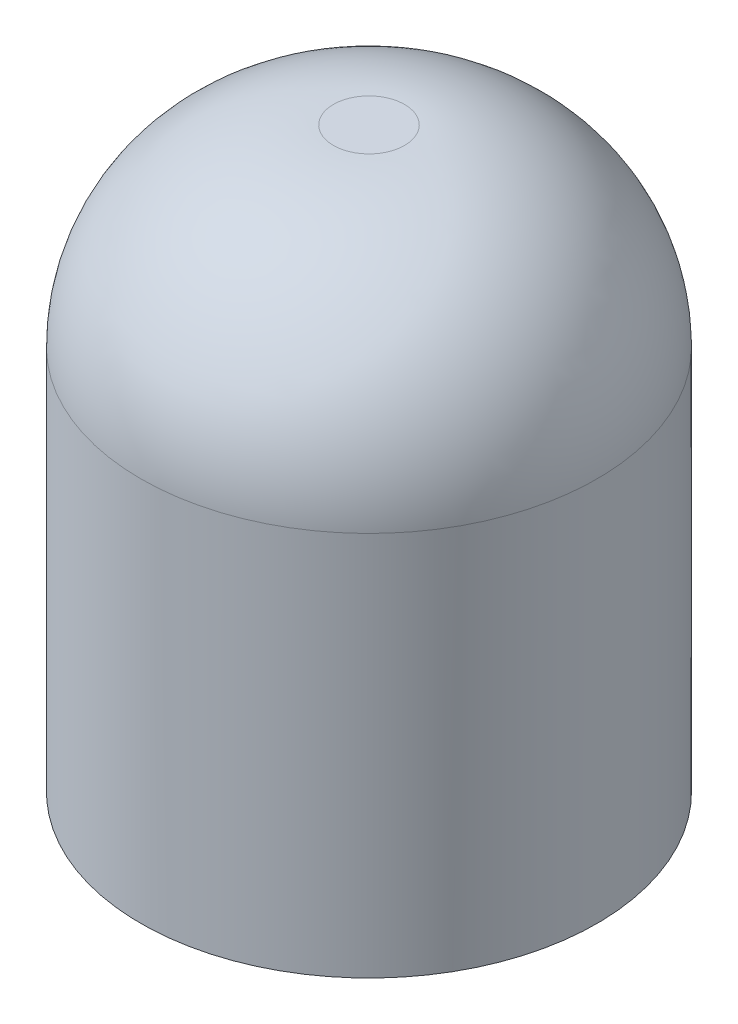
ISO-10303-21;
HEADER;
FILE_DESCRIPTION(('STEP AP214'),'2;1');
FILE_NAME('part.step','',(''),(''),'','','');
FILE_SCHEMA(('AUTOMOTIVE_DESIGN { 1 0 10303 214 1 1 1 1 }'));
ENDSEC;
DATA;
#1=APPLICATION_CONTEXT('core data for automotive mechanical design processes');
#2=APPLICATION_PROTOCOL_DEFINITION('international standard','automotive_design',2000,#1);
#3=PRODUCT_CONTEXT('',#1,'mechanical');
#4=PRODUCT('Part','Part','',(#3));
#5=PRODUCT_RELATED_PRODUCT_CATEGORY('part','',(#4));
#6=PRODUCT_DEFINITION_FORMATION('','',#4);
#7=PRODUCT_DEFINITION_CONTEXT('part definition',#1,'design');
#8=PRODUCT_DEFINITION('design','',#6,#7);
#9=PRODUCT_DEFINITION_SHAPE('','',#8);
#10=(LENGTH_UNIT() NAMED_UNIT(*) SI_UNIT(.MILLI.,.METRE.));
#11=(NAMED_UNIT(*) PLANE_ANGLE_UNIT() SI_UNIT($,.RADIAN.));
#12=(NAMED_UNIT(*) SI_UNIT($,.STERADIAN.) SOLID_ANGLE_UNIT());
#13=UNCERTAINTY_MEASURE_WITH_UNIT(LENGTH_MEASURE(1.E-05),#10,'distance_accuracy_value','');
#14=(GEOMETRIC_REPRESENTATION_CONTEXT(3) GLOBAL_UNCERTAINTY_ASSIGNED_CONTEXT((#13)) GLOBAL_UNIT_ASSIGNED_CONTEXT((#10,
#11,#12)) REPRESENTATION_CONTEXT('',''));
#15=CARTESIAN_POINT('',(0.,0.,0.));
#16=DIRECTION('',(0.,0.,1.));
#17=DIRECTION('',(1.,0.,0.));
#18=AXIS2_PLACEMENT_3D('',#15,#16,#17);
#19=CARTESIAN_POINT('',(0.,76.2,0.));
#20=DIRECTION('',(0.,-1.,0.));
#21=DIRECTION('',(0.,0.,-1.));
#22=AXIS2_PLACEMENT_3D('',#19,#20,#21);
#23=CYLINDRICAL_SURFACE('',#22,30.0913736250683);
#24=CARTESIAN_POINT('',(0.,50.8,0.));
#25=DIRECTION('',(0.,1.,0.));
#26=DIRECTION('',(0.,0.,1.));
#27=AXIS2_PLACEMENT_3D('',#24,#25,#26);
#28=CIRCLE('',#27,30.0913736250683);
#29=CARTESIAN_POINT('',(0.,50.8,-30.0913736250683));
#30=VERTEX_POINT('',#29);
#31=EDGE_CURVE('E10',#30,#30,#28,.F.);
#32=CARTESIAN_POINT('',(0.,0.,0.));
#33=DIRECTION('',(0.,1.,0.));
#34=DIRECTION('',(0.,0.,1.));
#35=AXIS2_PLACEMENT_3D('',#32,#33,#34);
#36=CIRCLE('',#35,30.0913736250683);
#37=CARTESIAN_POINT('',(0.,0.,-30.0913736250683));
#38=VERTEX_POINT('',#37);
#39=EDGE_CURVE('E42',#38,#38,#36,.T.);
#40=CARTESIAN_POINT('',(0.,50.8,-30.0913736250683));
#41=CARTESIAN_POINT('',(0.,50.2708333333333,-30.0913736250683));
#42=CARTESIAN_POINT('',(0.,49.7416666666666,-30.0913736250683));
#43=CARTESIAN_POINT('',(0.,48.6833333333333,-30.0913736250683));
#44=CARTESIAN_POINT('',(0.,48.1541666666666,-30.0913736250683));
#45=CARTESIAN_POINT('',(0.,47.0958333333333,-30.0913736250683));
#46=CARTESIAN_POINT('',(0.,46.5666666666666,-30.0913736250683));
#47=CARTESIAN_POINT('',(0.,45.5083333333333,-30.0913736250683));
#48=CARTESIAN_POINT('',(0.,44.9791666666666,-30.0913736250683));
#49=CARTESIAN_POINT('',(0.,43.9208333333333,-30.0913736250683));
#50=CARTESIAN_POINT('',(0.,43.3916666666666,-30.0913736250683));
#51=CARTESIAN_POINT('',(0.,42.3333333333333,-30.0913736250683));
#52=CARTESIAN_POINT('',(0.,41.8041666666666,-30.0913736250683));
#53=CARTESIAN_POINT('',(0.,40.7458333333333,-30.0913736250683));
#54=CARTESIAN_POINT('',(0.,40.2166666666666,-30.0913736250683));
#55=CARTESIAN_POINT('',(0.,39.1583333333333,-30.0913736250683));
#56=CARTESIAN_POINT('',(0.,38.6291666666666,-30.0913736250683));
#57=CARTESIAN_POINT('',(0.,37.5708333333333,-30.0913736250683));
#58=CARTESIAN_POINT('',(0.,37.0416666666666,-30.0913736250683));
#59=CARTESIAN_POINT('',(0.,35.9833333333333,-30.0913736250683));
#60=CARTESIAN_POINT('',(0.,35.4541666666666,-30.0913736250683));
#61=CARTESIAN_POINT('',(0.,34.3958333333333,-30.0913736250683));
#62=CARTESIAN_POINT('',(0.,33.8666666666666,-30.0913736250683));
#63=CARTESIAN_POINT('',(0.,32.8083333333333,-30.0913736250683));
#64=CARTESIAN_POINT('',(0.,32.2791666666666,-30.0913736250683));
#65=CARTESIAN_POINT('',(0.,31.2208333333333,-30.0913736250683));
#66=CARTESIAN_POINT('',(0.,30.6916666666666,-30.0913736250683));
#67=CARTESIAN_POINT('',(0.,29.6333333333333,-30.0913736250683));
#68=CARTESIAN_POINT('',(0.,29.1041666666667,-30.0913736250683));
#69=CARTESIAN_POINT('',(0.,28.0458333333333,-30.0913736250683));
#70=CARTESIAN_POINT('',(0.,27.5166666666666,-30.0913736250683));
#71=CARTESIAN_POINT('',(0.,26.4583333333333,-30.0913736250683));
#72=CARTESIAN_POINT('',(0.,25.9291666666666,-30.0913736250683));
#73=CARTESIAN_POINT('',(0.,24.8708333333333,-30.0913736250683));
#74=CARTESIAN_POINT('',(0.,24.3416666666666,-30.0913736250683));
#75=CARTESIAN_POINT('',(0.,23.2833333333333,-30.0913736250683));
#76=CARTESIAN_POINT('',(0.,22.7541666666667,-30.0913736250683));
#77=CARTESIAN_POINT('',(0.,21.6958333333333,-30.0913736250683));
#78=CARTESIAN_POINT('',(0.,21.1666666666667,-30.0913736250683));
#79=CARTESIAN_POINT('',(0.,20.1083333333333,-30.0913736250683));
#80=CARTESIAN_POINT('',(0.,19.5791666666667,-30.0913736250683));
#81=CARTESIAN_POINT('',(0.,18.5208333333333,-30.0913736250683));
#82=CARTESIAN_POINT('',(0.,17.9916666666667,-30.0913736250683));
#83=CARTESIAN_POINT('',(0.,16.9333333333333,-30.0913736250683));
#84=CARTESIAN_POINT('',(0.,16.4041666666667,-30.0913736250683));
#85=CARTESIAN_POINT('',(0.,15.3458333333333,-30.0913736250683));
#86=CARTESIAN_POINT('',(0.,14.8166666666667,-30.0913736250683));
#87=CARTESIAN_POINT('',(0.,13.7583333333333,-30.0913736250683));
#88=CARTESIAN_POINT('',(0.,13.2291666666667,-30.0913736250683));
#89=CARTESIAN_POINT('',(0.,12.1708333333333,-30.0913736250683));
#90=CARTESIAN_POINT('',(0.,11.6416666666667,-30.0913736250683));
#91=CARTESIAN_POINT('',(0.,10.5833333333333,-30.0913736250683));
#92=CARTESIAN_POINT('',(0.,10.0541666666667,-30.0913736250683));
#93=CARTESIAN_POINT('',(0.,8.99583333333333,-30.0913736250683));
#94=CARTESIAN_POINT('',(0.,8.46666666666666,-30.0913736250683));
#95=CARTESIAN_POINT('',(0.,7.40833333333332,-30.0913736250683));
#96=CARTESIAN_POINT('',(0.,6.87916666666666,-30.0913736250683));
#97=CARTESIAN_POINT('',(0.,5.82083333333333,-30.0913736250683));
#98=CARTESIAN_POINT('',(0.,5.29166666666667,-30.0913736250683));
#99=CARTESIAN_POINT('',(0.,4.23333333333333,-30.0913736250683));
#100=CARTESIAN_POINT('',(0.,3.70416666666667,-30.0913736250683));
#101=CARTESIAN_POINT('',(0.,2.64583333333333,-30.0913736250683));
#102=CARTESIAN_POINT('',(0.,2.11666666666666,-30.0913736250683));
#103=CARTESIAN_POINT('',(0.,1.05833333333333,-30.0913736250683));
#104=CARTESIAN_POINT('',(0.,0.529166666666664,-30.0913736250683));
#105=CARTESIAN_POINT('',(0.,0.,-30.0913736250683));
#106=B_SPLINE_CURVE_WITH_KNOTS('',3,(#40,#41,#42,#43,#44,#45,#46,#47,#48,#49,#50,#51,#52,#53,
#54,#55,#56,#57,#58,#59,#60,#61,#62,#63,#64,#65,#66,#67,#68,#69,#70,#71,#72,#73,#74,#75,#76,#77,
#78,#79,#80,#81,#82,#83,#84,#85,#86,#87,#88,#89,#90,#91,#92,#93,#94,#95,#96,#97,#98,#99,#100,
#101,#102,#103,#104,#105),.UNSPECIFIED.,.F.,.F.,(4,2,2,2,2,2,2,2,2,2,2,2,2,2,2,2,2,2,2,2,2,2,2,
2,2,2,2,2,2,2,2,2,4),(0.,1.58750000000001,3.175,4.7625,6.34999999999999,7.93749999999999,9.525,
11.1125,12.7,14.2875,15.875,17.4625,19.05,20.6375,22.225,23.8125,25.4,26.9875,28.575,30.1625,
31.75,33.3375,34.925,36.5125,38.1,39.6875,41.275,42.8625,44.45,46.0375,47.625,49.2125,50.8),.UNSPECIFIED.);
#107=EDGE_CURVE('BSEAM31',#30,#38,#106,.T.);
#108=ORIENTED_EDGE('',*,*,#31,.T.);
#109=ORIENTED_EDGE('',*,*,#39,.T.);
#110=ORIENTED_EDGE('',*,*,#107,.T.);
#111=ORIENTED_EDGE('',*,*,#107,.F.);
#112=EDGE_LOOP('',(#108,#110,#109,#111));
#113=FACE_BOUND('',#112,.T.);
#114=ADVANCED_FACE('F31',(#113),#23,.T.);
#115=CARTESIAN_POINT('',(0.,76.2,0.));
#116=DIRECTION('',(0.,1.,0.));
#117=DIRECTION('',(0.,0.,1.));
#118=AXIS2_PLACEMENT_3D('',#115,#116,#117);
#119=PLANE('',#118);
#120=CARTESIAN_POINT('',(0.,76.2,0.));
#121=DIRECTION('',(0.,1.,0.));
#122=DIRECTION('',(0.,0.,1.));
#123=AXIS2_PLACEMENT_3D('',#120,#121,#122);
#124=CIRCLE('',#123,4.69137362506826);
#125=CARTESIAN_POINT('',(0.,76.2,4.69137362506826));
#126=VERTEX_POINT('',#125);
#127=EDGE_CURVE('E38',#126,#126,#124,.T.);
#128=ORIENTED_EDGE('',*,*,#127,.T.);
#129=EDGE_LOOP('',(#128));
#130=FACE_BOUND('',#129,.T.);
#131=ADVANCED_FACE('F52',(#130),#119,.T.);
#132=CARTESIAN_POINT('',(0.,0.,0.));
#133=DIRECTION('',(0.,1.,0.));
#134=DIRECTION('',(0.,0.,1.));
#135=AXIS2_PLACEMENT_3D('',#132,#133,#134);
#136=PLANE('',#135);
#137=ORIENTED_EDGE('',*,*,#39,.F.);
#138=EDGE_LOOP('',(#137));
#139=FACE_BOUND('',#138,.T.);
#140=ADVANCED_FACE('F50',(#139),#136,.F.);
#141=CARTESIAN_POINT('',(0.,50.8,0.));
#142=DIRECTION('',(0.,1.,0.));
#143=DIRECTION('',(0.,0.,1.));
#144=AXIS2_PLACEMENT_3D('',#141,#142,#143);
#145=DEGENERATE_TOROIDAL_SURFACE('',#144,4.69137362506826,25.4,.T.);
#146=ORIENTED_EDGE('',*,*,#31,.F.);
#147=EDGE_LOOP('',(#146));
#148=FACE_BOUND('',#147,.T.);
#149=ORIENTED_EDGE('',*,*,#127,.F.);
#150=EDGE_LOOP('',(#149));
#151=FACE_BOUND('',#150,.T.);
#152=ADVANCED_FACE('F33',(#148,#151),#145,.T.);
#153=CLOSED_SHELL('',(#114,#131,#140,#152));
#154=MANIFOLD_SOLID_BREP('B2',#153);
#155=ADVANCED_BREP_SHAPE_REPRESENTATION('',(#18,#154),#14);
#156=SHAPE_DEFINITION_REPRESENTATION(#9,#155);
ENDSEC;
END-ISO-10303-21;
